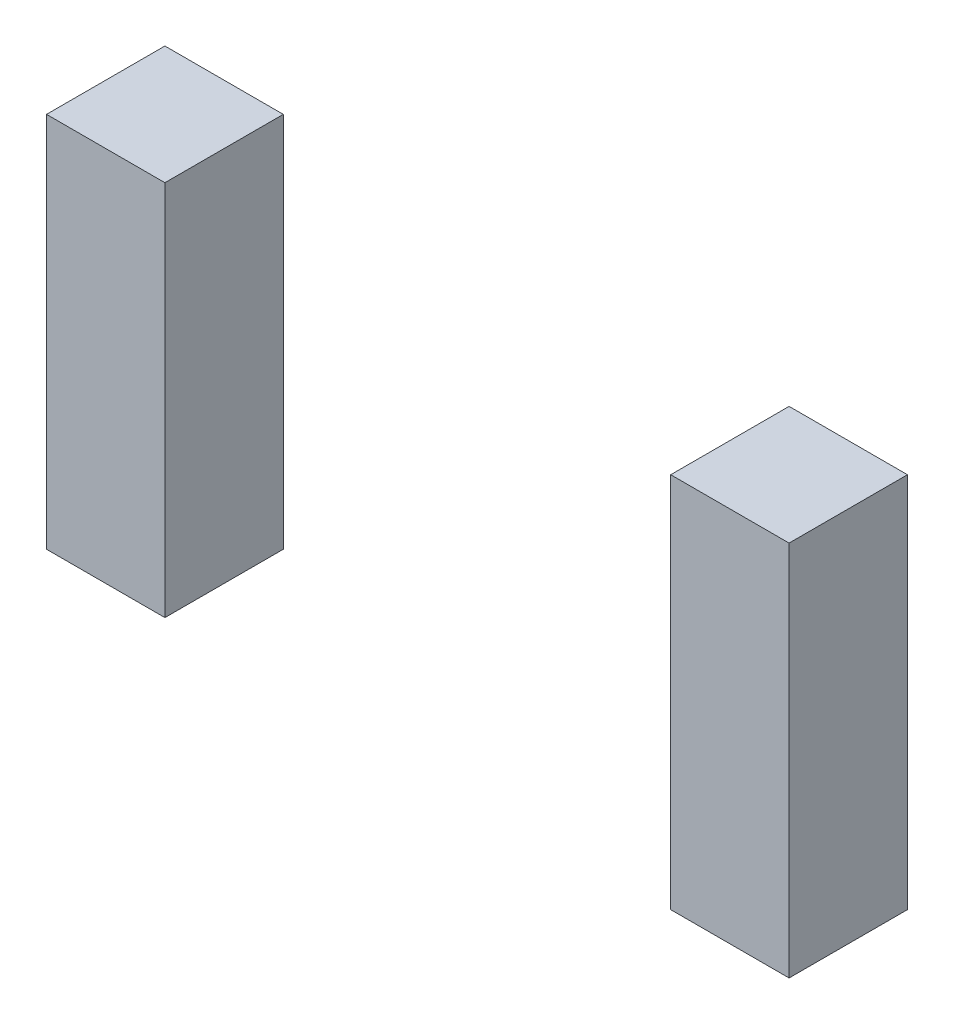
ISO-10303-21;
HEADER;
FILE_DESCRIPTION(('STEP AP214'),'2;1');
FILE_NAME('part.step','',(''),(''),'','','');
FILE_SCHEMA(('AUTOMOTIVE_DESIGN { 1 0 10303 214 1 1 1 1 }'));
ENDSEC;
DATA;
#1=APPLICATION_CONTEXT('core data for automotive mechanical design processes');
#2=APPLICATION_PROTOCOL_DEFINITION('international standard','automotive_design',2000,#1);
#3=PRODUCT_CONTEXT('',#1,'mechanical');
#4=PRODUCT('Part','Part','',(#3));
#5=PRODUCT_RELATED_PRODUCT_CATEGORY('part','',(#4));
#6=PRODUCT_DEFINITION_FORMATION('','',#4);
#7=PRODUCT_DEFINITION_CONTEXT('part definition',#1,'design');
#8=PRODUCT_DEFINITION('design','',#6,#7);
#9=PRODUCT_DEFINITION_SHAPE('','',#8);
#10=(LENGTH_UNIT() NAMED_UNIT(*) SI_UNIT(.MILLI.,.METRE.));
#11=(NAMED_UNIT(*) PLANE_ANGLE_UNIT() SI_UNIT($,.RADIAN.));
#12=(NAMED_UNIT(*) SI_UNIT($,.STERADIAN.) SOLID_ANGLE_UNIT());
#13=UNCERTAINTY_MEASURE_WITH_UNIT(LENGTH_MEASURE(1.E-05),#10,'distance_accuracy_value','');
#14=(GEOMETRIC_REPRESENTATION_CONTEXT(3) GLOBAL_UNCERTAINTY_ASSIGNED_CONTEXT((#13)) GLOBAL_UNIT_ASSIGNED_CONTEXT((#10,
#11,#12)) REPRESENTATION_CONTEXT('',''));
#15=CARTESIAN_POINT('',(0.,0.,0.));
#16=DIRECTION('',(0.,0.,1.));
#17=DIRECTION('',(1.,0.,0.));
#18=AXIS2_PLACEMENT_3D('',#15,#16,#17);
#19=CARTESIAN_POINT('',(65.4822942182394,70.,-16.6424148416434));
#20=DIRECTION('',(1.,0.,0.));
#21=DIRECTION('',(0.,0.,-1.));
#22=AXIS2_PLACEMENT_3D('',#19,#20,#21);
#23=PLANE('',#22);
#24=DIRECTION('',(0.,0.,1.));
#25=VECTOR('',#24,1.);
#26=CARTESIAN_POINT('',(65.4822942182394,0.,-16.6424148416434));
#27=LINE('',#26,#25);
#28=CARTESIAN_POINT('',(65.4822942182394,0.,-16.6424148416434));
#29=VERTEX_POINT('',#28);
#30=CARTESIAN_POINT('',(65.4822942182394,0.,5.35758515835665));
#31=VERTEX_POINT('',#30);
#32=EDGE_CURVE('E105',#29,#31,#27,.T.);
#33=ORIENTED_EDGE('',*,*,#32,.T.);
#34=DIRECTION('',(0.,-1.,0.));
#35=VECTOR('',#34,1.);
#36=CARTESIAN_POINT('',(65.4822942182394,70.,5.35758515835665));
#37=LINE('',#36,#35);
#38=CARTESIAN_POINT('',(65.4822942182394,70.,5.35758515835665));
#39=VERTEX_POINT('',#38);
#40=EDGE_CURVE('E12',#39,#31,#37,.T.);
#41=ORIENTED_EDGE('',*,*,#40,.F.);
#42=DIRECTION('',(0.,0.,1.));
#43=VECTOR('',#42,1.);
#44=CARTESIAN_POINT('',(65.4822942182394,70.,-16.6424148416434));
#45=LINE('',#44,#43);
#46=CARTESIAN_POINT('',(65.4822942182394,70.,-16.6424148416434));
#47=VERTEX_POINT('',#46);
#48=EDGE_CURVE('E93',#47,#39,#45,.T.);
#49=ORIENTED_EDGE('',*,*,#48,.F.);
#50=DIRECTION('',(0.,-1.,0.));
#51=VECTOR('',#50,1.);
#52=CARTESIAN_POINT('',(65.4822942182394,70.,-16.6424148416434));
#53=LINE('',#52,#51);
#54=EDGE_CURVE('E101',#47,#29,#53,.T.);
#55=ORIENTED_EDGE('',*,*,#54,.T.);
#56=EDGE_LOOP('',(#33,#41,#49,#55));
#57=FACE_BOUND('',#56,.T.);
#58=ADVANCED_FACE('F42',(#57),#23,.F.);
#59=CARTESIAN_POINT('',(65.4822942182394,70.,5.35758515835665));
#60=DIRECTION('',(0.,0.,-1.));
#61=DIRECTION('',(-1.,0.,0.));
#62=AXIS2_PLACEMENT_3D('',#59,#60,#61);
#63=PLANE('',#62);
#64=DIRECTION('',(1.,0.,0.));
#65=VECTOR('',#64,1.);
#66=CARTESIAN_POINT('',(65.4822942182394,0.,5.35758515835665));
#67=LINE('',#66,#65);
#68=CARTESIAN_POINT('',(87.4822942182394,0.,5.35758515835665));
#69=VERTEX_POINT('',#68);
#70=EDGE_CURVE('E97',#31,#69,#67,.T.);
#71=ORIENTED_EDGE('',*,*,#70,.T.);
#72=DIRECTION('',(0.,-1.,0.));
#73=VECTOR('',#72,1.);
#74=CARTESIAN_POINT('',(87.4822942182394,70.,5.35758515835665));
#75=LINE('',#74,#73);
#76=CARTESIAN_POINT('',(87.4822942182394,70.,5.35758515835665));
#77=VERTEX_POINT('',#76);
#78=EDGE_CURVE('E50',#77,#69,#75,.T.);
#79=ORIENTED_EDGE('',*,*,#78,.F.);
#80=DIRECTION('',(1.,0.,0.));
#81=VECTOR('',#80,1.);
#82=CARTESIAN_POINT('',(65.4822942182394,70.,5.35758515835665));
#83=LINE('',#82,#81);
#84=EDGE_CURVE('E88',#39,#77,#83,.T.);
#85=ORIENTED_EDGE('',*,*,#84,.F.);
#86=ORIENTED_EDGE('',*,*,#40,.T.);
#87=EDGE_LOOP('',(#71,#79,#85,#86));
#88=FACE_BOUND('',#87,.T.);
#89=ADVANCED_FACE('F96',(#88),#63,.F.);
#90=CARTESIAN_POINT('',(87.4822942182394,70.,-16.6424148416433));
#91=DIRECTION('',(-1.,0.,0.));
#92=DIRECTION('',(0.,0.,1.));
#93=AXIS2_PLACEMENT_3D('',#90,#91,#92);
#94=PLANE('',#93);
#95=DIRECTION('',(0.,0.,-1.));
#96=VECTOR('',#95,1.);
#97=CARTESIAN_POINT('',(87.4822942182394,0.,-16.6424148416433));
#98=LINE('',#97,#96);
#99=CARTESIAN_POINT('',(87.4822942182394,0.,-16.6424148416433));
#100=VERTEX_POINT('',#99);
#101=EDGE_CURVE('E75',#69,#100,#98,.T.);
#102=ORIENTED_EDGE('',*,*,#101,.T.);
#103=DIRECTION('',(0.,-1.,0.));
#104=VECTOR('',#103,1.);
#105=CARTESIAN_POINT('',(87.4822942182394,70.,-16.6424148416433));
#106=LINE('',#105,#104);
#107=CARTESIAN_POINT('',(87.4822942182394,70.,-16.6424148416433));
#108=VERTEX_POINT('',#107);
#109=EDGE_CURVE('E98',#108,#100,#106,.T.);
#110=ORIENTED_EDGE('',*,*,#109,.F.);
#111=DIRECTION('',(0.,0.,-1.));
#112=VECTOR('',#111,1.);
#113=CARTESIAN_POINT('',(87.4822942182394,70.,-16.6424148416433));
#114=LINE('',#113,#112);
#115=EDGE_CURVE('E91',#77,#108,#114,.T.);
#116=ORIENTED_EDGE('',*,*,#115,.F.);
#117=ORIENTED_EDGE('',*,*,#78,.T.);
#118=EDGE_LOOP('',(#102,#110,#116,#117));
#119=FACE_BOUND('',#118,.T.);
#120=ADVANCED_FACE('F99',(#119),#94,.F.);
#121=CARTESIAN_POINT('',(65.4822942182394,70.,-16.6424148416434));
#122=DIRECTION('',(0.,0.,1.));
#123=DIRECTION('',(1.,0.,0.));
#124=AXIS2_PLACEMENT_3D('',#121,#122,#123);
#125=PLANE('',#124);
#126=DIRECTION('',(-1.,0.,0.));
#127=VECTOR('',#126,1.);
#128=CARTESIAN_POINT('',(65.4822942182394,0.,-16.6424148416434));
#129=LINE('',#128,#127);
#130=EDGE_CURVE('E81',#100,#29,#129,.T.);
#131=ORIENTED_EDGE('',*,*,#130,.T.);
#132=ORIENTED_EDGE('',*,*,#54,.F.);
#133=DIRECTION('',(-1.,0.,0.));
#134=VECTOR('',#133,1.);
#135=CARTESIAN_POINT('',(65.4822942182394,70.,-16.6424148416434));
#136=LINE('',#135,#134);
#137=EDGE_CURVE('E58',#108,#47,#136,.T.);
#138=ORIENTED_EDGE('',*,*,#137,.F.);
#139=ORIENTED_EDGE('',*,*,#109,.T.);
#140=EDGE_LOOP('',(#131,#132,#138,#139));
#141=FACE_BOUND('',#140,.T.);
#142=ADVANCED_FACE('F112',(#141),#125,.F.);
#143=CARTESIAN_POINT('',(0.,70.,0.));
#144=DIRECTION('',(0.,1.,0.));
#145=DIRECTION('',(0.,0.,1.));
#146=AXIS2_PLACEMENT_3D('',#143,#144,#145);
#147=PLANE('',#146);
#148=ORIENTED_EDGE('',*,*,#48,.T.);
#149=ORIENTED_EDGE('',*,*,#84,.T.);
#150=ORIENTED_EDGE('',*,*,#115,.T.);
#151=ORIENTED_EDGE('',*,*,#137,.T.);
#152=EDGE_LOOP('',(#148,#149,#150,#151));
#153=FACE_BOUND('',#152,.T.);
#154=ADVANCED_FACE('F89',(#153),#147,.T.);
#155=CARTESIAN_POINT('',(0.,0.,0.));
#156=DIRECTION('',(0.,1.,0.));
#157=DIRECTION('',(0.,0.,1.));
#158=AXIS2_PLACEMENT_3D('',#155,#156,#157);
#159=PLANE('',#158);
#160=ORIENTED_EDGE('',*,*,#32,.F.);
#161=ORIENTED_EDGE('',*,*,#130,.F.);
#162=ORIENTED_EDGE('',*,*,#101,.F.);
#163=ORIENTED_EDGE('',*,*,#70,.F.);
#164=EDGE_LOOP('',(#160,#161,#162,#163));
#165=FACE_BOUND('',#164,.T.);
#166=ADVANCED_FACE('F115',(#165),#159,.F.);
#167=CLOSED_SHELL('',(#58,#89,#120,#142,#154,#166));
#168=MANIFOLD_SOLID_BREP('B2',#167);
#169=CARTESIAN_POINT('',(-50.5177057817605,70.,-16.6424148416433));
#170=DIRECTION('',(1.,0.,0.));
#171=DIRECTION('',(0.,0.,-1.));
#172=AXIS2_PLACEMENT_3D('',#169,#170,#171);
#173=PLANE('',#172);
#174=DIRECTION('',(0.,0.,1.));
#175=VECTOR('',#174,1.);
#176=CARTESIAN_POINT('',(-50.5177057817605,0.,-16.6424148416433));
#177=LINE('',#176,#175);
#178=CARTESIAN_POINT('',(-50.5177057817605,0.,-16.6424148416433));
#179=VERTEX_POINT('',#178);
#180=CARTESIAN_POINT('',(-50.5177057817605,0.,5.35758515835666));
#181=VERTEX_POINT('',#180);
#182=EDGE_CURVE('E228',#179,#181,#177,.T.);
#183=ORIENTED_EDGE('',*,*,#182,.T.);
#184=DIRECTION('',(0.,-1.,0.));
#185=VECTOR('',#184,1.);
#186=CARTESIAN_POINT('',(-50.5177057817605,70.,5.35758515835666));
#187=LINE('',#186,#185);
#188=CARTESIAN_POINT('',(-50.5177057817605,70.,5.35758515835666));
#189=VERTEX_POINT('',#188);
#190=EDGE_CURVE('E40',#189,#181,#187,.T.);
#191=ORIENTED_EDGE('',*,*,#190,.F.);
#192=DIRECTION('',(0.,0.,1.));
#193=VECTOR('',#192,1.);
#194=CARTESIAN_POINT('',(-50.5177057817605,70.,-16.6424148416433));
#195=LINE('',#194,#193);
#196=CARTESIAN_POINT('',(-50.5177057817605,70.,-16.6424148416433));
#197=VERTEX_POINT('',#196);
#198=EDGE_CURVE('E216',#197,#189,#195,.T.);
#199=ORIENTED_EDGE('',*,*,#198,.F.);
#200=DIRECTION('',(0.,-1.,0.));
#201=VECTOR('',#200,1.);
#202=CARTESIAN_POINT('',(-50.5177057817605,70.,-16.6424148416433));
#203=LINE('',#202,#201);
#204=EDGE_CURVE('E224',#197,#179,#203,.T.);
#205=ORIENTED_EDGE('',*,*,#204,.T.);
#206=EDGE_LOOP('',(#183,#191,#199,#205));
#207=FACE_BOUND('',#206,.T.);
#208=ADVANCED_FACE('F165',(#207),#173,.F.);
#209=CARTESIAN_POINT('',(-50.5177057817605,70.,5.35758515835666));
#210=DIRECTION('',(0.,0.,-1.));
#211=DIRECTION('',(-1.,0.,0.));
#212=AXIS2_PLACEMENT_3D('',#209,#210,#211);
#213=PLANE('',#212);
#214=DIRECTION('',(1.,0.,0.));
#215=VECTOR('',#214,1.);
#216=CARTESIAN_POINT('',(-50.5177057817605,0.,5.35758515835666));
#217=LINE('',#216,#215);
#218=CARTESIAN_POINT('',(-28.5177057817605,0.,5.35758515835666));
#219=VERTEX_POINT('',#218);
#220=EDGE_CURVE('E220',#181,#219,#217,.T.);
#221=ORIENTED_EDGE('',*,*,#220,.T.);
#222=DIRECTION('',(0.,-1.,0.));
#223=VECTOR('',#222,1.);
#224=CARTESIAN_POINT('',(-28.5177057817605,70.,5.35758515835666));
#225=LINE('',#224,#223);
#226=CARTESIAN_POINT('',(-28.5177057817605,70.,5.35758515835666));
#227=VERTEX_POINT('',#226);
#228=EDGE_CURVE('E173',#227,#219,#225,.T.);
#229=ORIENTED_EDGE('',*,*,#228,.F.);
#230=DIRECTION('',(1.,0.,0.));
#231=VECTOR('',#230,1.);
#232=CARTESIAN_POINT('',(-50.5177057817605,70.,5.35758515835666));
#233=LINE('',#232,#231);
#234=EDGE_CURVE('E211',#189,#227,#233,.T.);
#235=ORIENTED_EDGE('',*,*,#234,.F.);
#236=ORIENTED_EDGE('',*,*,#190,.T.);
#237=EDGE_LOOP('',(#221,#229,#235,#236));
#238=FACE_BOUND('',#237,.T.);
#239=ADVANCED_FACE('F219',(#238),#213,.F.);
#240=CARTESIAN_POINT('',(-28.5177057817605,70.,-16.6424148416433));
#241=DIRECTION('',(-1.,0.,0.));
#242=DIRECTION('',(0.,0.,1.));
#243=AXIS2_PLACEMENT_3D('',#240,#241,#242);
#244=PLANE('',#243);
#245=DIRECTION('',(0.,0.,-1.));
#246=VECTOR('',#245,1.);
#247=CARTESIAN_POINT('',(-28.5177057817605,0.,-16.6424148416433));
#248=LINE('',#247,#246);
#249=CARTESIAN_POINT('',(-28.5177057817605,0.,-16.6424148416433));
#250=VERTEX_POINT('',#249);
#251=EDGE_CURVE('E198',#219,#250,#248,.T.);
#252=ORIENTED_EDGE('',*,*,#251,.T.);
#253=DIRECTION('',(0.,-1.,0.));
#254=VECTOR('',#253,1.);
#255=CARTESIAN_POINT('',(-28.5177057817605,70.,-16.6424148416433));
#256=LINE('',#255,#254);
#257=CARTESIAN_POINT('',(-28.5177057817605,70.,-16.6424148416433));
#258=VERTEX_POINT('',#257);
#259=EDGE_CURVE('E221',#258,#250,#256,.T.);
#260=ORIENTED_EDGE('',*,*,#259,.F.);
#261=DIRECTION('',(0.,0.,-1.));
#262=VECTOR('',#261,1.);
#263=CARTESIAN_POINT('',(-28.5177057817605,70.,-16.6424148416433));
#264=LINE('',#263,#262);
#265=EDGE_CURVE('E214',#227,#258,#264,.T.);
#266=ORIENTED_EDGE('',*,*,#265,.F.);
#267=ORIENTED_EDGE('',*,*,#228,.T.);
#268=EDGE_LOOP('',(#252,#260,#266,#267));
#269=FACE_BOUND('',#268,.T.);
#270=ADVANCED_FACE('F222',(#269),#244,.F.);
#271=CARTESIAN_POINT('',(-50.5177057817605,70.,-16.6424148416433));
#272=DIRECTION('',(0.,0.,1.));
#273=DIRECTION('',(1.,0.,0.));
#274=AXIS2_PLACEMENT_3D('',#271,#272,#273);
#275=PLANE('',#274);
#276=DIRECTION('',(-1.,0.,0.));
#277=VECTOR('',#276,1.);
#278=CARTESIAN_POINT('',(-50.5177057817605,0.,-16.6424148416433));
#279=LINE('',#278,#277);
#280=EDGE_CURVE('E204',#250,#179,#279,.T.);
#281=ORIENTED_EDGE('',*,*,#280,.T.);
#282=ORIENTED_EDGE('',*,*,#204,.F.);
#283=DIRECTION('',(-1.,0.,0.));
#284=VECTOR('',#283,1.);
#285=CARTESIAN_POINT('',(-50.5177057817605,70.,-16.6424148416433));
#286=LINE('',#285,#284);
#287=EDGE_CURVE('E181',#258,#197,#286,.T.);
#288=ORIENTED_EDGE('',*,*,#287,.F.);
#289=ORIENTED_EDGE('',*,*,#259,.T.);
#290=EDGE_LOOP('',(#281,#282,#288,#289));
#291=FACE_BOUND('',#290,.T.);
#292=ADVANCED_FACE('F235',(#291),#275,.F.);
#293=CARTESIAN_POINT('',(0.,70.,0.));
#294=DIRECTION('',(0.,1.,0.));
#295=DIRECTION('',(0.,0.,1.));
#296=AXIS2_PLACEMENT_3D('',#293,#294,#295);
#297=PLANE('',#296);
#298=ORIENTED_EDGE('',*,*,#198,.T.);
#299=ORIENTED_EDGE('',*,*,#234,.T.);
#300=ORIENTED_EDGE('',*,*,#265,.T.);
#301=ORIENTED_EDGE('',*,*,#287,.T.);
#302=EDGE_LOOP('',(#298,#299,#300,#301));
#303=FACE_BOUND('',#302,.T.);
#304=ADVANCED_FACE('F212',(#303),#297,.T.);
#305=CARTESIAN_POINT('',(0.,0.,0.));
#306=DIRECTION('',(0.,1.,0.));
#307=DIRECTION('',(0.,0.,1.));
#308=AXIS2_PLACEMENT_3D('',#305,#306,#307);
#309=PLANE('',#308);
#310=ORIENTED_EDGE('',*,*,#182,.F.);
#311=ORIENTED_EDGE('',*,*,#280,.F.);
#312=ORIENTED_EDGE('',*,*,#251,.F.);
#313=ORIENTED_EDGE('',*,*,#220,.F.);
#314=EDGE_LOOP('',(#310,#311,#312,#313));
#315=FACE_BOUND('',#314,.T.);
#316=ADVANCED_FACE('F238',(#315),#309,.F.);
#317=CLOSED_SHELL('',(#208,#239,#270,#292,#304,#316));
#318=MANIFOLD_SOLID_BREP('B6',#317);
#319=ADVANCED_BREP_SHAPE_REPRESENTATION('',(#18,#168,#318),#14);
#320=SHAPE_DEFINITION_REPRESENTATION(#9,#319);
ENDSEC;
END-ISO-10303-21;
